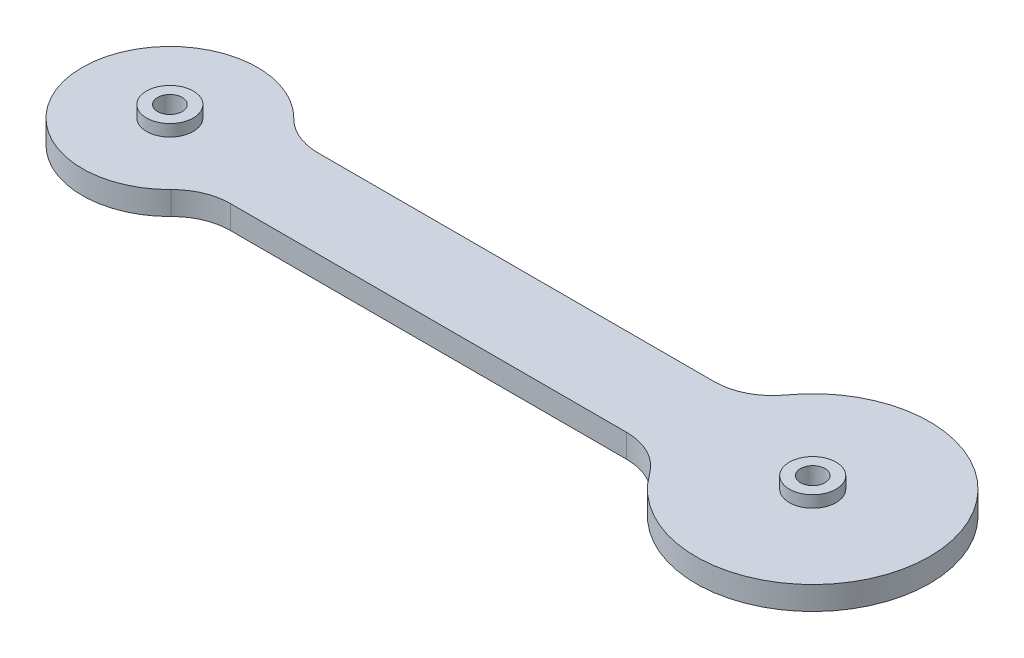
ISO-10303-21;
HEADER;
FILE_DESCRIPTION(('STEP AP214'),'2;1');
FILE_NAME('part.step','',(''),(''),'','','');
FILE_SCHEMA(('AUTOMOTIVE_DESIGN { 1 0 10303 214 1 1 1 1 }'));
ENDSEC;
DATA;
#1=APPLICATION_CONTEXT('core data for automotive mechanical design processes');
#2=APPLICATION_PROTOCOL_DEFINITION('international standard','automotive_design',2000,#1);
#3=PRODUCT_CONTEXT('',#1,'mechanical');
#4=PRODUCT('Part','Part','',(#3));
#5=PRODUCT_RELATED_PRODUCT_CATEGORY('part','',(#4));
#6=PRODUCT_DEFINITION_FORMATION('','',#4);
#7=PRODUCT_DEFINITION_CONTEXT('part definition',#1,'design');
#8=PRODUCT_DEFINITION('design','',#6,#7);
#9=PRODUCT_DEFINITION_SHAPE('','',#8);
#10=(LENGTH_UNIT() NAMED_UNIT(*) SI_UNIT(.MILLI.,.METRE.));
#11=(NAMED_UNIT(*) PLANE_ANGLE_UNIT() SI_UNIT($,.RADIAN.));
#12=(NAMED_UNIT(*) SI_UNIT($,.STERADIAN.) SOLID_ANGLE_UNIT());
#13=UNCERTAINTY_MEASURE_WITH_UNIT(LENGTH_MEASURE(1.E-05),#10,'distance_accuracy_value','');
#14=(GEOMETRIC_REPRESENTATION_CONTEXT(3) GLOBAL_UNCERTAINTY_ASSIGNED_CONTEXT((#13)) GLOBAL_UNIT_ASSIGNED_CONTEXT((#10,
#11,#12)) REPRESENTATION_CONTEXT('',''));
#15=CARTESIAN_POINT('',(0.,0.,0.));
#16=DIRECTION('',(0.,0.,1.));
#17=DIRECTION('',(1.,0.,0.));
#18=AXIS2_PLACEMENT_3D('',#15,#16,#17);
#19=CARTESIAN_POINT('',(55.,4.,0.));
#20=DIRECTION('',(0.,1.,0.));
#21=DIRECTION('',(0.,0.,1.));
#22=AXIS2_PLACEMENT_3D('',#19,#20,#21);
#23=PLANE('',#22);
#24=CARTESIAN_POINT('',(55.,4.,0.));
#25=DIRECTION('',(0.,1.,0.));
#26=DIRECTION('',(0.,0.,1.));
#27=AXIS2_PLACEMENT_3D('',#24,#25,#26);
#28=CIRCLE('',#27,4.00000000000001);
#29=CARTESIAN_POINT('',(55.,4.,4.00000000000001));
#30=VERTEX_POINT('',#29);
#31=EDGE_CURVE('E185',#30,#30,#28,.T.);
#32=ORIENTED_EDGE('',*,*,#31,.F.);
#33=EDGE_LOOP('',(#32));
#34=FACE_BOUND('',#33,.T.);
#35=DIRECTION('',(1.,0.,0.));
#36=VECTOR('',#35,1.);
#37=CARTESIAN_POINT('',(-42.0096189432334,4.,7.5));
#38=LINE('',#37,#36);
#39=CARTESIAN_POINT('',(-37.1464289286429,4.,7.5));
#40=VERTEX_POINT('',#39);
#41=CARTESIAN_POINT('',(30.6330141379776,4.,7.5));
#42=VERTEX_POINT('',#41);
#43=EDGE_CURVE('E133',#40,#42,#38,.T.);
#44=ORIENTED_EDGE('',*,*,#43,.T.);
#45=CARTESIAN_POINT('',(30.6330141379776,4.,17.5));
#46=DIRECTION('',(0.,1.,0.));
#47=DIRECTION('',(0.,0.,1.));
#48=AXIS2_PLACEMENT_3D('',#45,#46,#47);
#49=CIRCLE('',#48,10.);
#50=CARTESIAN_POINT('',(38.7553427586517,4.,11.6666666666667));
#51=VERTEX_POINT('',#50);
#52=EDGE_CURVE('E154',#42,#51,#49,.F.);
#53=ORIENTED_EDGE('',*,*,#52,.T.);
#54=CARTESIAN_POINT('',(55.,4.,0.));
#55=DIRECTION('',(0.,1.,0.));
#56=DIRECTION('',(0.,0.,1.));
#57=AXIS2_PLACEMENT_3D('',#54,#55,#56);
#58=CIRCLE('',#57,20.);
#59=CARTESIAN_POINT('',(38.7553427586517,4.,-11.6666666666667));
#60=VERTEX_POINT('',#59);
#61=EDGE_CURVE('E127',#51,#60,#58,.T.);
#62=ORIENTED_EDGE('',*,*,#61,.T.);
#63=CARTESIAN_POINT('',(30.6330141379776,4.,-17.5));
#64=DIRECTION('',(0.,1.,0.));
#65=DIRECTION('',(0.,0.,1.));
#66=AXIS2_PLACEMENT_3D('',#63,#64,#65);
#67=CIRCLE('',#66,10.);
#68=CARTESIAN_POINT('',(30.6330141379776,4.,-7.5));
#69=VERTEX_POINT('',#68);
#70=EDGE_CURVE('E150',#60,#69,#67,.F.);
#71=ORIENTED_EDGE('',*,*,#70,.T.);
#72=DIRECTION('',(-1.,0.,0.));
#73=VECTOR('',#72,1.);
#74=CARTESIAN_POINT('',(-42.0096189432334,4.,-7.5));
#75=LINE('',#74,#73);
#76=CARTESIAN_POINT('',(-37.1464289286429,4.,-7.5));
#77=VERTEX_POINT('',#76);
#78=EDGE_CURVE('E166',#69,#77,#75,.T.);
#79=ORIENTED_EDGE('',*,*,#78,.T.);
#80=CARTESIAN_POINT('',(-37.1464289286429,4.,-17.5));
#81=DIRECTION('',(0.,1.,0.));
#82=DIRECTION('',(0.,0.,1.));
#83=AXIS2_PLACEMENT_3D('',#80,#81,#82);
#84=CIRCLE('',#83,10.);
#85=CARTESIAN_POINT('',(-44.2878573571857,4.,-10.5));
#86=VERTEX_POINT('',#85);
#87=EDGE_CURVE('E108',#77,#86,#84,.F.);
#88=ORIENTED_EDGE('',*,*,#87,.T.);
#89=CARTESIAN_POINT('',(-55.,4.,0.));
#90=DIRECTION('',(0.,1.,0.));
#91=DIRECTION('',(0.,0.,1.));
#92=AXIS2_PLACEMENT_3D('',#89,#90,#91);
#93=CIRCLE('',#92,15.);
#94=CARTESIAN_POINT('',(-44.2878573571857,4.,10.5));
#95=VERTEX_POINT('',#94);
#96=EDGE_CURVE('E116',#86,#95,#93,.T.);
#97=ORIENTED_EDGE('',*,*,#96,.T.);
#98=CARTESIAN_POINT('',(-37.1464289286429,4.,17.5));
#99=DIRECTION('',(0.,1.,0.));
#100=DIRECTION('',(0.,0.,1.));
#101=AXIS2_PLACEMENT_3D('',#98,#99,#100);
#102=CIRCLE('',#101,10.);
#103=EDGE_CURVE('E11',#95,#40,#102,.F.);
#104=ORIENTED_EDGE('',*,*,#103,.T.);
#105=EDGE_LOOP('',(#44,#53,#62,#71,#79,#88,#97,#104));
#106=FACE_BOUND('',#105,.T.);
#107=CARTESIAN_POINT('',(-55.,4.,0.));
#108=DIRECTION('',(0.,1.,0.));
#109=DIRECTION('',(0.,0.,1.));
#110=AXIS2_PLACEMENT_3D('',#107,#108,#109);
#111=CIRCLE('',#110,4.00000000000001);
#112=CARTESIAN_POINT('',(-55.,4.,4.00000000000001));
#113=VERTEX_POINT('',#112);
#114=EDGE_CURVE('E194',#113,#113,#111,.T.);
#115=ORIENTED_EDGE('',*,*,#114,.F.);
#116=EDGE_LOOP('',(#115));
#117=FACE_BOUND('',#116,.T.);
#118=ADVANCED_FACE('F33',(#34,#106,#117),#23,.T.);
#119=CARTESIAN_POINT('',(55.,0.,0.));
#120=DIRECTION('',(0.,1.,0.));
#121=DIRECTION('',(0.,0.,1.));
#122=AXIS2_PLACEMENT_3D('',#119,#120,#121);
#123=PLANE('',#122);
#124=CARTESIAN_POINT('',(55.,0.,0.));
#125=DIRECTION('',(0.,1.,0.));
#126=DIRECTION('',(0.,0.,1.));
#127=AXIS2_PLACEMENT_3D('',#124,#125,#126);
#128=CIRCLE('',#127,20.);
#129=CARTESIAN_POINT('',(38.7553427586517,0.,11.6666666666667));
#130=VERTEX_POINT('',#129);
#131=CARTESIAN_POINT('',(38.7553427586517,0.,-11.6666666666667));
#132=VERTEX_POINT('',#131);
#133=EDGE_CURVE('E129',#130,#132,#128,.T.);
#134=ORIENTED_EDGE('',*,*,#133,.F.);
#135=CARTESIAN_POINT('',(30.6330141379776,0.,17.5));
#136=DIRECTION('',(0.,1.,0.));
#137=DIRECTION('',(0.,0.,1.));
#138=AXIS2_PLACEMENT_3D('',#135,#136,#137);
#139=CIRCLE('',#138,10.);
#140=CARTESIAN_POINT('',(30.6330141379776,0.,7.5));
#141=VERTEX_POINT('',#140);
#142=EDGE_CURVE('E152',#130,#141,#139,.T.);
#143=ORIENTED_EDGE('',*,*,#142,.T.);
#144=DIRECTION('',(1.,0.,0.));
#145=VECTOR('',#144,1.);
#146=CARTESIAN_POINT('',(-42.0096189432334,0.,7.5));
#147=LINE('',#146,#145);
#148=CARTESIAN_POINT('',(-37.1464289286429,0.,7.5));
#149=VERTEX_POINT('',#148);
#150=EDGE_CURVE('E124',#149,#141,#147,.T.);
#151=ORIENTED_EDGE('',*,*,#150,.F.);
#152=CARTESIAN_POINT('',(-37.1464289286429,0.,17.5));
#153=DIRECTION('',(0.,1.,0.));
#154=DIRECTION('',(0.,0.,1.));
#155=AXIS2_PLACEMENT_3D('',#152,#153,#154);
#156=CIRCLE('',#155,10.);
#157=CARTESIAN_POINT('',(-44.2878573571857,0.,10.5));
#158=VERTEX_POINT('',#157);
#159=EDGE_CURVE('E41',#149,#158,#156,.T.);
#160=ORIENTED_EDGE('',*,*,#159,.T.);
#161=CARTESIAN_POINT('',(-55.,0.,0.));
#162=DIRECTION('',(0.,1.,0.));
#163=DIRECTION('',(0.,0.,1.));
#164=AXIS2_PLACEMENT_3D('',#161,#162,#163);
#165=CIRCLE('',#164,15.);
#166=CARTESIAN_POINT('',(-44.2878573571857,0.,-10.5));
#167=VERTEX_POINT('',#166);
#168=EDGE_CURVE('E114',#167,#158,#165,.T.);
#169=ORIENTED_EDGE('',*,*,#168,.F.);
#170=CARTESIAN_POINT('',(-37.1464289286429,0.,-17.5));
#171=DIRECTION('',(0.,1.,0.));
#172=DIRECTION('',(0.,0.,1.));
#173=AXIS2_PLACEMENT_3D('',#170,#171,#172);
#174=CIRCLE('',#173,10.);
#175=CARTESIAN_POINT('',(-37.1464289286429,0.,-7.5));
#176=VERTEX_POINT('',#175);
#177=EDGE_CURVE('E98',#167,#176,#174,.T.);
#178=ORIENTED_EDGE('',*,*,#177,.T.);
#179=DIRECTION('',(-1.,0.,0.));
#180=VECTOR('',#179,1.);
#181=CARTESIAN_POINT('',(-42.0096189432334,0.,-7.5));
#182=LINE('',#181,#180);
#183=CARTESIAN_POINT('',(30.6330141379776,0.,-7.5));
#184=VERTEX_POINT('',#183);
#185=EDGE_CURVE('E125',#184,#176,#182,.T.);
#186=ORIENTED_EDGE('',*,*,#185,.F.);
#187=CARTESIAN_POINT('',(30.6330141379776,0.,-17.5));
#188=DIRECTION('',(0.,1.,0.));
#189=DIRECTION('',(0.,0.,1.));
#190=AXIS2_PLACEMENT_3D('',#187,#188,#189);
#191=CIRCLE('',#190,10.);
#192=EDGE_CURVE('E148',#184,#132,#191,.T.);
#193=ORIENTED_EDGE('',*,*,#192,.T.);
#194=EDGE_LOOP('',(#134,#143,#151,#160,#169,#178,#186,#193));
#195=FACE_BOUND('',#194,.T.);
#196=CARTESIAN_POINT('',(-55.,0.,0.));
#197=DIRECTION('',(0.,1.,0.));
#198=DIRECTION('',(0.,0.,1.));
#199=AXIS2_PLACEMENT_3D('',#196,#197,#198);
#200=CIRCLE('',#199,2.1);
#201=CARTESIAN_POINT('',(-55.,0.,2.1));
#202=VERTEX_POINT('',#201);
#203=EDGE_CURVE('E176',#202,#202,#200,.T.);
#204=ORIENTED_EDGE('',*,*,#203,.T.);
#205=EDGE_LOOP('',(#204));
#206=FACE_BOUND('',#205,.T.);
#207=CARTESIAN_POINT('',(55.,0.,0.));
#208=DIRECTION('',(0.,1.,0.));
#209=DIRECTION('',(0.,0.,1.));
#210=AXIS2_PLACEMENT_3D('',#207,#208,#209);
#211=CIRCLE('',#210,2.1);
#212=CARTESIAN_POINT('',(55.,0.,2.1));
#213=VERTEX_POINT('',#212);
#214=EDGE_CURVE('E178',#213,#213,#211,.T.);
#215=ORIENTED_EDGE('',*,*,#214,.T.);
#216=EDGE_LOOP('',(#215));
#217=FACE_BOUND('',#216,.T.);
#218=ADVANCED_FACE('F121',(#195,#206,#217),#123,.F.);
#219=CARTESIAN_POINT('',(55.,4.,0.));
#220=DIRECTION('',(0.,-1.,0.));
#221=DIRECTION('',(0.,0.,-1.));
#222=AXIS2_PLACEMENT_3D('',#219,#220,#221);
#223=CYLINDRICAL_SURFACE('',#222,20.);
#224=ORIENTED_EDGE('',*,*,#133,.T.);
#225=DIRECTION('',(0.,-1.,0.));
#226=VECTOR('',#225,1.);
#227=CARTESIAN_POINT('',(38.7553427586517,4.,-11.6666666666667));
#228=LINE('',#227,#226);
#229=EDGE_CURVE('E141',#132,#60,#228,.F.);
#230=ORIENTED_EDGE('',*,*,#229,.T.);
#231=ORIENTED_EDGE('',*,*,#61,.F.);
#232=DIRECTION('',(0.,-1.,0.));
#233=VECTOR('',#232,1.);
#234=CARTESIAN_POINT('',(38.7553427586517,4.,11.6666666666667));
#235=LINE('',#234,#233);
#236=EDGE_CURVE('E138',#51,#130,#235,.T.);
#237=ORIENTED_EDGE('',*,*,#236,.T.);
#238=EDGE_LOOP('',(#224,#230,#231,#237));
#239=FACE_BOUND('',#238,.T.);
#240=ADVANCED_FACE('F164',(#239),#223,.T.);
#241=CARTESIAN_POINT('',(-42.0096189432334,4.,-7.5));
#242=DIRECTION('',(0.,0.,1.));
#243=DIRECTION('',(1.,0.,0.));
#244=AXIS2_PLACEMENT_3D('',#241,#242,#243);
#245=PLANE('',#244);
#246=ORIENTED_EDGE('',*,*,#185,.T.);
#247=DIRECTION('',(0.,1.,0.));
#248=VECTOR('',#247,1.);
#249=CARTESIAN_POINT('',(-37.1464289286429,4.,-7.5));
#250=LINE('',#249,#248);
#251=EDGE_CURVE('E103',#176,#77,#250,.T.);
#252=ORIENTED_EDGE('',*,*,#251,.T.);
#253=ORIENTED_EDGE('',*,*,#78,.F.);
#254=DIRECTION('',(0.,1.,0.));
#255=VECTOR('',#254,1.);
#256=CARTESIAN_POINT('',(30.6330141379776,0.,-7.5));
#257=LINE('',#256,#255);
#258=EDGE_CURVE('E117',#69,#184,#257,.F.);
#259=ORIENTED_EDGE('',*,*,#258,.T.);
#260=EDGE_LOOP('',(#246,#252,#253,#259));
#261=FACE_BOUND('',#260,.T.);
#262=ADVANCED_FACE('F235',(#261),#245,.F.);
#263=CARTESIAN_POINT('',(-55.,4.,0.));
#264=DIRECTION('',(0.,-1.,0.));
#265=DIRECTION('',(0.,0.,-1.));
#266=AXIS2_PLACEMENT_3D('',#263,#264,#265);
#267=CYLINDRICAL_SURFACE('',#266,15.);
#268=ORIENTED_EDGE('',*,*,#96,.F.);
#269=DIRECTION('',(0.,-1.,0.));
#270=VECTOR('',#269,1.);
#271=CARTESIAN_POINT('',(-44.2878573571857,4.,-10.5));
#272=LINE('',#271,#270);
#273=EDGE_CURVE('E102',#86,#167,#272,.T.);
#274=ORIENTED_EDGE('',*,*,#273,.T.);
#275=ORIENTED_EDGE('',*,*,#168,.T.);
#276=DIRECTION('',(0.,-1.,0.));
#277=VECTOR('',#276,1.);
#278=CARTESIAN_POINT('',(-44.2878573571857,4.,10.5));
#279=LINE('',#278,#277);
#280=EDGE_CURVE('E118',#158,#95,#279,.F.);
#281=ORIENTED_EDGE('',*,*,#280,.T.);
#282=EDGE_LOOP('',(#268,#274,#275,#281));
#283=FACE_BOUND('',#282,.T.);
#284=ADVANCED_FACE('F113',(#283),#267,.T.);
#285=CARTESIAN_POINT('',(-42.0096189432334,4.,7.5));
#286=DIRECTION('',(0.,0.,-1.));
#287=DIRECTION('',(-1.,0.,0.));
#288=AXIS2_PLACEMENT_3D('',#285,#286,#287);
#289=PLANE('',#288);
#290=ORIENTED_EDGE('',*,*,#150,.T.);
#291=DIRECTION('',(0.,1.,0.));
#292=VECTOR('',#291,1.);
#293=CARTESIAN_POINT('',(30.6330141379776,4.,7.5));
#294=LINE('',#293,#292);
#295=EDGE_CURVE('E48',#141,#42,#294,.T.);
#296=ORIENTED_EDGE('',*,*,#295,.T.);
#297=ORIENTED_EDGE('',*,*,#43,.F.);
#298=DIRECTION('',(0.,1.,0.));
#299=VECTOR('',#298,1.);
#300=CARTESIAN_POINT('',(-37.1464289286429,0.,7.5));
#301=LINE('',#300,#299);
#302=EDGE_CURVE('E143',#40,#149,#301,.F.);
#303=ORIENTED_EDGE('',*,*,#302,.T.);
#304=EDGE_LOOP('',(#290,#296,#297,#303));
#305=FACE_BOUND('',#304,.T.);
#306=ADVANCED_FACE('F169',(#305),#289,.F.);
#307=CARTESIAN_POINT('',(-55.,4.,0.));
#308=DIRECTION('',(0.,-1.,0.));
#309=DIRECTION('',(0.,0.,-1.));
#310=AXIS2_PLACEMENT_3D('',#307,#308,#309);
#311=CYLINDRICAL_SURFACE('',#310,2.1);
#312=ORIENTED_EDGE('',*,*,#203,.F.);
#313=EDGE_LOOP('',(#312));
#314=FACE_BOUND('',#313,.T.);
#315=CARTESIAN_POINT('',(-55.,6.,0.));
#316=DIRECTION('',(0.,1.,0.));
#317=DIRECTION('',(0.,0.,1.));
#318=AXIS2_PLACEMENT_3D('',#315,#316,#317);
#319=CIRCLE('',#318,2.1);
#320=CARTESIAN_POINT('',(-55.,6.,2.1));
#321=VERTEX_POINT('',#320);
#322=EDGE_CURVE('E197',#321,#321,#319,.T.);
#323=ORIENTED_EDGE('',*,*,#322,.T.);
#324=EDGE_LOOP('',(#323));
#325=FACE_BOUND('',#324,.T.);
#326=ADVANCED_FACE('F203',(#314,#325),#311,.F.);
#327=CARTESIAN_POINT('',(55.,4.,0.));
#328=DIRECTION('',(0.,-1.,0.));
#329=DIRECTION('',(0.,0.,-1.));
#330=AXIS2_PLACEMENT_3D('',#327,#328,#329);
#331=CYLINDRICAL_SURFACE('',#330,2.1);
#332=ORIENTED_EDGE('',*,*,#214,.F.);
#333=EDGE_LOOP('',(#332));
#334=FACE_BOUND('',#333,.T.);
#335=CARTESIAN_POINT('',(55.,6.,0.));
#336=DIRECTION('',(0.,1.,0.));
#337=DIRECTION('',(0.,0.,1.));
#338=AXIS2_PLACEMENT_3D('',#335,#336,#337);
#339=CIRCLE('',#338,2.1);
#340=CARTESIAN_POINT('',(55.,6.,2.1));
#341=VERTEX_POINT('',#340);
#342=EDGE_CURVE('E188',#341,#341,#339,.T.);
#343=ORIENTED_EDGE('',*,*,#342,.T.);
#344=EDGE_LOOP('',(#343));
#345=FACE_BOUND('',#344,.T.);
#346=ADVANCED_FACE('F244',(#334,#345),#331,.F.);
#347=CARTESIAN_POINT('',(-37.1464289286429,4.,-17.5));
#348=DIRECTION('',(0.,-1.,0.));
#349=DIRECTION('',(0.,0.,-1.));
#350=AXIS2_PLACEMENT_3D('',#347,#348,#349);
#351=CYLINDRICAL_SURFACE('',#350,10.);
#352=ORIENTED_EDGE('',*,*,#87,.F.);
#353=ORIENTED_EDGE('',*,*,#251,.F.);
#354=ORIENTED_EDGE('',*,*,#177,.F.);
#355=ORIENTED_EDGE('',*,*,#273,.F.);
#356=EDGE_LOOP('',(#352,#353,#354,#355));
#357=FACE_BOUND('',#356,.T.);
#358=ADVANCED_FACE('F101',(#357),#351,.F.);
#359=CARTESIAN_POINT('',(30.6330141379776,4.,-17.5));
#360=DIRECTION('',(0.,-1.,0.));
#361=DIRECTION('',(0.,0.,-1.));
#362=AXIS2_PLACEMENT_3D('',#359,#360,#361);
#363=CYLINDRICAL_SURFACE('',#362,10.);
#364=ORIENTED_EDGE('',*,*,#70,.F.);
#365=ORIENTED_EDGE('',*,*,#229,.F.);
#366=ORIENTED_EDGE('',*,*,#192,.F.);
#367=ORIENTED_EDGE('',*,*,#258,.F.);
#368=EDGE_LOOP('',(#364,#365,#366,#367));
#369=FACE_BOUND('',#368,.T.);
#370=ADVANCED_FACE('F243',(#369),#363,.F.);
#371=CARTESIAN_POINT('',(30.6330141379776,4.,17.5));
#372=DIRECTION('',(0.,-1.,0.));
#373=DIRECTION('',(0.,0.,-1.));
#374=AXIS2_PLACEMENT_3D('',#371,#372,#373);
#375=CYLINDRICAL_SURFACE('',#374,10.);
#376=ORIENTED_EDGE('',*,*,#52,.F.);
#377=ORIENTED_EDGE('',*,*,#295,.F.);
#378=ORIENTED_EDGE('',*,*,#142,.F.);
#379=ORIENTED_EDGE('',*,*,#236,.F.);
#380=EDGE_LOOP('',(#376,#377,#378,#379));
#381=FACE_BOUND('',#380,.T.);
#382=ADVANCED_FACE('F168',(#381),#375,.F.);
#383=CARTESIAN_POINT('',(-37.1464289286429,4.,17.5));
#384=DIRECTION('',(0.,-1.,0.));
#385=DIRECTION('',(0.,0.,-1.));
#386=AXIS2_PLACEMENT_3D('',#383,#384,#385);
#387=CYLINDRICAL_SURFACE('',#386,10.);
#388=ORIENTED_EDGE('',*,*,#103,.F.);
#389=ORIENTED_EDGE('',*,*,#280,.F.);
#390=ORIENTED_EDGE('',*,*,#159,.F.);
#391=ORIENTED_EDGE('',*,*,#302,.F.);
#392=EDGE_LOOP('',(#388,#389,#390,#391));
#393=FACE_BOUND('',#392,.T.);
#394=ADVANCED_FACE('F35',(#393),#387,.F.);
#395=CARTESIAN_POINT('',(55.,6.,0.));
#396=DIRECTION('',(0.,1.,0.));
#397=DIRECTION('',(0.,0.,1.));
#398=AXIS2_PLACEMENT_3D('',#395,#396,#397);
#399=PLANE('',#398);
#400=CARTESIAN_POINT('',(55.,6.,0.));
#401=DIRECTION('',(0.,1.,0.));
#402=DIRECTION('',(0.,0.,1.));
#403=AXIS2_PLACEMENT_3D('',#400,#401,#402);
#404=CIRCLE('',#403,4.00000000000001);
#405=CARTESIAN_POINT('',(55.,6.,4.00000000000001));
#406=VERTEX_POINT('',#405);
#407=EDGE_CURVE('E182',#406,#406,#404,.T.);
#408=ORIENTED_EDGE('',*,*,#407,.T.);
#409=EDGE_LOOP('',(#408));
#410=FACE_BOUND('',#409,.T.);
#411=ORIENTED_EDGE('',*,*,#342,.F.);
#412=EDGE_LOOP('',(#411));
#413=FACE_BOUND('',#412,.T.);
#414=ADVANCED_FACE('F217',(#410,#413),#399,.T.);
#415=CARTESIAN_POINT('',(55.,6.,0.));
#416=DIRECTION('',(0.,-1.,0.));
#417=DIRECTION('',(0.,0.,-1.));
#418=AXIS2_PLACEMENT_3D('',#415,#416,#417);
#419=CYLINDRICAL_SURFACE('',#418,4.00000000000001);
#420=ORIENTED_EDGE('',*,*,#407,.F.);
#421=EDGE_LOOP('',(#420));
#422=FACE_BOUND('',#421,.T.);
#423=ORIENTED_EDGE('',*,*,#31,.T.);
#424=EDGE_LOOP('',(#423));
#425=FACE_BOUND('',#424,.T.);
#426=ADVANCED_FACE('F208',(#422,#425),#419,.T.);
#427=CARTESIAN_POINT('',(-55.,6.,0.));
#428=DIRECTION('',(0.,1.,0.));
#429=DIRECTION('',(0.,0.,1.));
#430=AXIS2_PLACEMENT_3D('',#427,#428,#429);
#431=PLANE('',#430);
#432=CARTESIAN_POINT('',(-55.,6.,0.));
#433=DIRECTION('',(0.,1.,0.));
#434=DIRECTION('',(0.,0.,1.));
#435=AXIS2_PLACEMENT_3D('',#432,#433,#434);
#436=CIRCLE('',#435,4.00000000000001);
#437=CARTESIAN_POINT('',(-55.,6.,4.00000000000001));
#438=VERTEX_POINT('',#437);
#439=EDGE_CURVE('E193',#438,#438,#436,.T.);
#440=ORIENTED_EDGE('',*,*,#439,.T.);
#441=EDGE_LOOP('',(#440));
#442=FACE_BOUND('',#441,.T.);
#443=ORIENTED_EDGE('',*,*,#322,.F.);
#444=EDGE_LOOP('',(#443));
#445=FACE_BOUND('',#444,.T.);
#446=ADVANCED_FACE('F205',(#442,#445),#431,.T.);
#447=CARTESIAN_POINT('',(-55.,6.,0.));
#448=DIRECTION('',(0.,-1.,0.));
#449=DIRECTION('',(0.,0.,-1.));
#450=AXIS2_PLACEMENT_3D('',#447,#448,#449);
#451=CYLINDRICAL_SURFACE('',#450,4.00000000000001);
#452=ORIENTED_EDGE('',*,*,#439,.F.);
#453=EDGE_LOOP('',(#452));
#454=FACE_BOUND('',#453,.T.);
#455=ORIENTED_EDGE('',*,*,#114,.T.);
#456=EDGE_LOOP('',(#455));
#457=FACE_BOUND('',#456,.T.);
#458=ADVANCED_FACE('F207',(#454,#457),#451,.T.);
#459=CLOSED_SHELL('',(#118,#218,#240,#262,#284,#306,#326,#346,#358,#370,#382,#394,#414,#426,
#446,#458));
#460=MANIFOLD_SOLID_BREP('B2',#459);
#461=ADVANCED_BREP_SHAPE_REPRESENTATION('',(#18,#460),#14);
#462=SHAPE_DEFINITION_REPRESENTATION(#9,#461);
ENDSEC;
END-ISO-10303-21;
